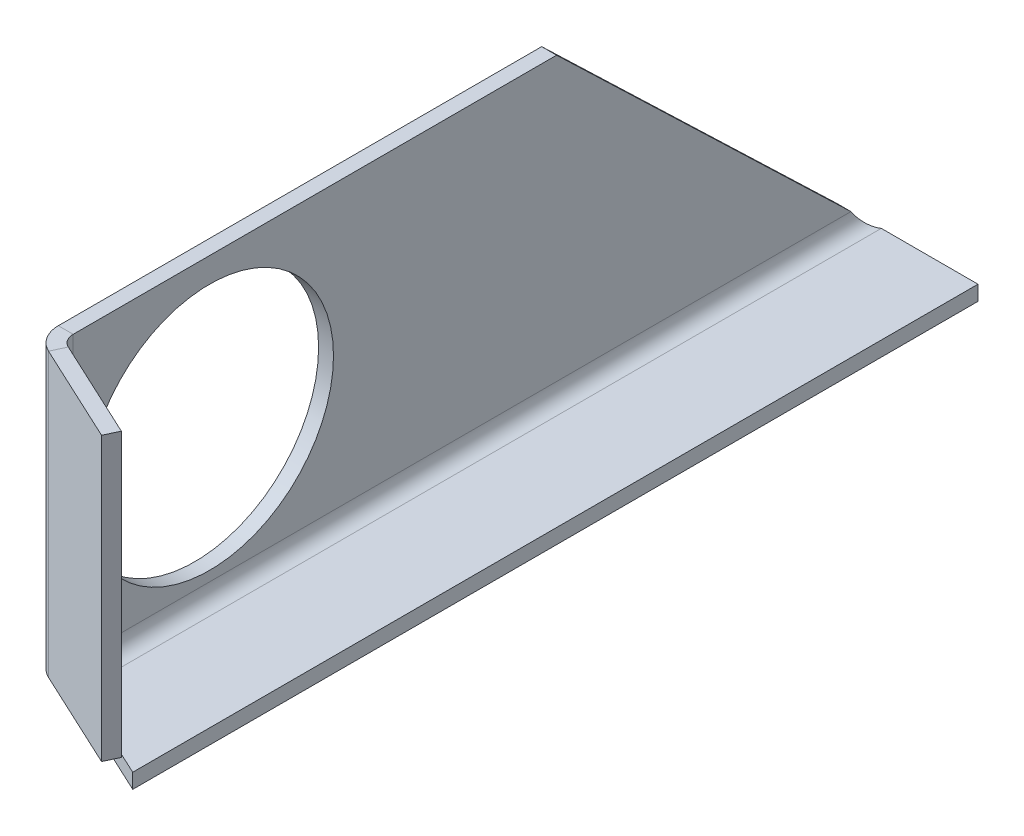
ISO-10303-21;
HEADER;
FILE_DESCRIPTION(('STEP AP214'),'2;1');
FILE_NAME('part.step','',(''),(''),'','','');
FILE_SCHEMA(('AUTOMOTIVE_DESIGN { 1 0 10303 214 1 1 1 1 }'));
ENDSEC;
DATA;
#1=APPLICATION_CONTEXT('core data for automotive mechanical design processes');
#2=APPLICATION_PROTOCOL_DEFINITION('international standard','automotive_design',2000,#1);
#3=PRODUCT_CONTEXT('',#1,'mechanical');
#4=PRODUCT('Part','Part','',(#3));
#5=PRODUCT_RELATED_PRODUCT_CATEGORY('part','',(#4));
#6=PRODUCT_DEFINITION_FORMATION('','',#4);
#7=PRODUCT_DEFINITION_CONTEXT('part definition',#1,'design');
#8=PRODUCT_DEFINITION('design','',#6,#7);
#9=PRODUCT_DEFINITION_SHAPE('','',#8);
#10=(LENGTH_UNIT() NAMED_UNIT(*) SI_UNIT(.MILLI.,.METRE.));
#11=(NAMED_UNIT(*) PLANE_ANGLE_UNIT() SI_UNIT($,.RADIAN.));
#12=(NAMED_UNIT(*) SI_UNIT($,.STERADIAN.) SOLID_ANGLE_UNIT());
#13=UNCERTAINTY_MEASURE_WITH_UNIT(LENGTH_MEASURE(1.E-05),#10,'distance_accuracy_value','');
#14=(GEOMETRIC_REPRESENTATION_CONTEXT(3) GLOBAL_UNCERTAINTY_ASSIGNED_CONTEXT((#13)) GLOBAL_UNIT_ASSIGNED_CONTEXT((#10,
#11,#12)) REPRESENTATION_CONTEXT('',''));
#15=CARTESIAN_POINT('',(0.,0.,0.));
#16=DIRECTION('',(0.,0.,1.));
#17=DIRECTION('',(1.,0.,0.));
#18=AXIS2_PLACEMENT_3D('',#15,#16,#17);
#19=CARTESIAN_POINT('',(-6.,0.,0.));
#20=DIRECTION('',(-1.,0.,0.));
#21=DIRECTION('',(0.,0.,1.));
#22=AXIS2_PLACEMENT_3D('',#19,#20,#21);
#23=PLANE('',#22);
#24=CARTESIAN_POINT('',(-6.,0.,0.));
#25=DIRECTION('',(1.,0.,0.));
#26=DIRECTION('',(0.,0.,-1.));
#27=AXIS2_PLACEMENT_3D('',#24,#25,#26);
#28=CIRCLE('',#27,50.);
#29=CARTESIAN_POINT('',(-6.,0.,-50.));
#30=VERTEX_POINT('',#29);
#31=EDGE_CURVE('E289',#30,#30,#28,.T.);
#32=ORIENTED_EDGE('',*,*,#31,.T.);
#33=EDGE_LOOP('',(#32));
#34=FACE_BOUND('',#33,.T.);
#35=DIRECTION('',(0.,0.692531828189713,0.721387321030952));
#36=VECTOR('',#35,1.);
#37=CARTESIAN_POINT('',(-6.,101.165695253955,-97.1190674437966));
#38=LINE('',#37,#36);
#39=CARTESIAN_POINT('',(-6.,60.,-140.));
#40=VERTEX_POINT('',#39);
#41=CARTESIAN_POINT('',(-5.99999999999999,-54.,-258.75));
#42=VERTEX_POINT('',#41);
#43=EDGE_CURVE('E13',#40,#42,#38,.F.);
#44=ORIENTED_EDGE('',*,*,#43,.T.);
#45=DIRECTION('',(0.,0.,-1.));
#46=VECTOR('',#45,1.);
#47=CARTESIAN_POINT('',(-5.99999999999999,-54.,-265.));
#48=LINE('',#47,#46);
#49=CARTESIAN_POINT('',(-6.00000000000005,-54.,55.));
#50=VERTEX_POINT('',#49);
#51=EDGE_CURVE('E234',#42,#50,#48,.F.);
#52=ORIENTED_EDGE('',*,*,#51,.T.);
#53=DIRECTION('',(0.,-1.,0.));
#54=VECTOR('',#53,1.);
#55=CARTESIAN_POINT('',(-6.,-60.,55.));
#56=LINE('',#55,#54);
#57=CARTESIAN_POINT('',(-6.,60.,55.));
#58=VERTEX_POINT('',#57);
#59=EDGE_CURVE('E325',#58,#50,#56,.T.);
#60=ORIENTED_EDGE('',*,*,#59,.F.);
#61=DIRECTION('',(0.,0.,1.));
#62=VECTOR('',#61,1.);
#63=CARTESIAN_POINT('',(-6.,60.,55.));
#64=LINE('',#63,#62);
#65=EDGE_CURVE('E331',#40,#58,#64,.T.);
#66=ORIENTED_EDGE('',*,*,#65,.F.);
#67=EDGE_LOOP('',(#44,#52,#60,#66));
#68=FACE_BOUND('',#67,.T.);
#69=ADVANCED_FACE('F58',(#34,#68),#23,.T.);
#70=CARTESIAN_POINT('',(0.,0.,0.));
#71=DIRECTION('',(-1.,0.,0.));
#72=DIRECTION('',(0.,0.,1.));
#73=AXIS2_PLACEMENT_3D('',#70,#71,#72);
#74=PLANE('',#73);
#75=CARTESIAN_POINT('',(0.,0.,0.));
#76=DIRECTION('',(1.,0.,0.));
#77=DIRECTION('',(0.,0.,-1.));
#78=AXIS2_PLACEMENT_3D('',#75,#76,#77);
#79=CIRCLE('',#78,50.);
#80=CARTESIAN_POINT('',(0.,0.,-50.));
#81=VERTEX_POINT('',#80);
#82=EDGE_CURVE('E241',#81,#81,#79,.T.);
#83=ORIENTED_EDGE('',*,*,#82,.F.);
#84=EDGE_LOOP('',(#83));
#85=FACE_BOUND('',#84,.T.);
#86=DIRECTION('',(0.,0.,-1.));
#87=VECTOR('',#86,1.);
#88=CARTESIAN_POINT('',(0.,-54.,-265.));
#89=LINE('',#88,#87);
#90=CARTESIAN_POINT('',(0.,-54.,-258.75));
#91=VERTEX_POINT('',#90);
#92=CARTESIAN_POINT('',(0.,-54.,55.));
#93=VERTEX_POINT('',#92);
#94=EDGE_CURVE('E231',#91,#93,#89,.F.);
#95=ORIENTED_EDGE('',*,*,#94,.F.);
#96=DIRECTION('',(0.,-0.692531828189713,-0.721387321030952));
#97=VECTOR('',#96,1.);
#98=CARTESIAN_POINT('',(0.,-60.0000000000004,-265.));
#99=LINE('',#98,#97);
#100=CARTESIAN_POINT('',(0.,60.,-140.));
#101=VERTEX_POINT('',#100);
#102=EDGE_CURVE('E80',#91,#101,#99,.F.);
#103=ORIENTED_EDGE('',*,*,#102,.T.);
#104=DIRECTION('',(0.,0.,1.));
#105=VECTOR('',#104,1.);
#106=CARTESIAN_POINT('',(0.,60.,55.));
#107=LINE('',#106,#105);
#108=CARTESIAN_POINT('',(0.,60.,55.));
#109=VERTEX_POINT('',#108);
#110=EDGE_CURVE('E320',#101,#109,#107,.T.);
#111=ORIENTED_EDGE('',*,*,#110,.T.);
#112=DIRECTION('',(0.,-1.,0.));
#113=VECTOR('',#112,1.);
#114=CARTESIAN_POINT('',(0.,-60.,55.));
#115=LINE('',#114,#113);
#116=EDGE_CURVE('E326',#109,#93,#115,.T.);
#117=ORIENTED_EDGE('',*,*,#116,.T.);
#118=EDGE_LOOP('',(#95,#103,#111,#117));
#119=FACE_BOUND('',#118,.T.);
#120=ADVANCED_FACE('F310',(#85,#119),#74,.F.);
#121=CARTESIAN_POINT('',(-6.,-60.0000000000004,-265.));
#122=DIRECTION('',(0.,-0.721387321030952,0.692531828189713));
#123=DIRECTION('',(1.,0.,0.));
#124=AXIS2_PLACEMENT_3D('',#121,#122,#123);
#125=PLANE('',#124);
#126=ORIENTED_EDGE('',*,*,#102,.F.);
#127=DIRECTION('',(-1.,0.,0.));
#128=VECTOR('',#127,1.);
#129=CARTESIAN_POINT('',(0.,-54.,-258.75));
#130=LINE('',#129,#128);
#131=EDGE_CURVE('E242',#91,#42,#130,.T.);
#132=ORIENTED_EDGE('',*,*,#131,.T.);
#133=ORIENTED_EDGE('',*,*,#43,.F.);
#134=DIRECTION('',(-1.,0.,0.));
#135=VECTOR('',#134,1.);
#136=CARTESIAN_POINT('',(-6.,60.,-140.));
#137=LINE('',#136,#135);
#138=EDGE_CURVE('E66',#101,#40,#137,.T.);
#139=ORIENTED_EDGE('',*,*,#138,.F.);
#140=EDGE_LOOP('',(#126,#132,#133,#139));
#141=FACE_BOUND('',#140,.T.);
#142=ADVANCED_FACE('F60',(#141),#125,.F.);
#143=CARTESIAN_POINT('',(-6.,60.,55.));
#144=DIRECTION('',(0.,1.,0.));
#145=DIRECTION('',(0.,0.,1.));
#146=AXIS2_PLACEMENT_3D('',#143,#144,#145);
#147=PLANE('',#146);
#148=ORIENTED_EDGE('',*,*,#110,.F.);
#149=ORIENTED_EDGE('',*,*,#138,.T.);
#150=ORIENTED_EDGE('',*,*,#65,.T.);
#151=DIRECTION('',(1.,0.,0.));
#152=VECTOR('',#151,1.);
#153=CARTESIAN_POINT('',(-6.,60.,55.));
#154=LINE('',#153,#152);
#155=EDGE_CURVE('E322',#58,#109,#154,.T.);
#156=ORIENTED_EDGE('',*,*,#155,.T.);
#157=EDGE_LOOP('',(#148,#149,#150,#156));
#158=FACE_BOUND('',#157,.T.);
#159=ADVANCED_FACE('F306',(#158),#147,.T.);
#160=CARTESIAN_POINT('',(-6.,0.,0.));
#161=DIRECTION('',(1.,0.,0.));
#162=DIRECTION('',(0.,0.,-1.));
#163=AXIS2_PLACEMENT_3D('',#160,#161,#162);
#164=CYLINDRICAL_SURFACE('',#163,50.);
#165=ORIENTED_EDGE('',*,*,#31,.F.);
#166=EDGE_LOOP('',(#165));
#167=FACE_BOUND('',#166,.T.);
#168=ORIENTED_EDGE('',*,*,#82,.T.);
#169=EDGE_LOOP('',(#168));
#170=FACE_BOUND('',#169,.T.);
#171=ADVANCED_FACE('F297',(#167,#170),#164,.F.);
#172=CARTESIAN_POINT('',(-6.06000000000001,-54.,55.));
#173=CARTESIAN_POINT('',(-6.06000000000001,-55.5789288833528,55.2331949848852));
#174=CARTESIAN_POINT('',(-5.74611048061989,-57.156679485373,55.466307658155));
#175=CARTESIAN_POINT('',(-4.53786384355235,-60.0736449032731,55.93261531631));
#176=CARTESIAN_POINT('',(-3.64398211932206,-61.4114334428975,56.1657691453875));
#177=CARTESIAN_POINT('',(-1.41143344289749,-63.6439821193221,56.6320768035425));
#178=CARTESIAN_POINT('',(-0.0736449032730689,-64.5378638435524,56.86523063262));
#179=CARTESIAN_POINT('',(2.84332051462705,-65.7461104806199,57.331538290775));
#180=CARTESIAN_POINT('',(4.42107111664722,-66.06,57.5646509640448));
#181=CARTESIAN_POINT('',(5.99999999999995,-66.06,57.79784594893));
#182=CARTESIAN_POINT('',(-6.00000000000002,-54.,55.));
#183=CARTESIAN_POINT('',(-6.00000000000001,-55.5710734320333,55.2331949599016));
#184=CARTESIAN_POINT('',(-5.68767212001979,-57.1409746123114,55.466307658155));
#185=CARTESIAN_POINT('',(-4.4854366602511,-60.0434277644508,55.93261531631));
#186=CARTESIAN_POINT('',(-3.59600210877817,-61.374560639699,56.1657691453875));
#187=CARTESIAN_POINT('',(-1.374560639699,-63.5960021087782,56.6320768035425));
#188=CARTESIAN_POINT('',(-0.0434277644508149,-64.4854366602511,56.86523063262));
#189=CARTESIAN_POINT('',(2.8590253876886,-65.6876721200198,57.331538290775));
#190=CARTESIAN_POINT('',(4.42892656796667,-66.,57.5646509890284));
#191=CARTESIAN_POINT('',(5.99999999999995,-66.,57.79784594893));
#192=CARTESIAN_POINT('',(0.,-54.,55.));
#193=CARTESIAN_POINT('',(0.,-54.7855283000878,55.2331924615433));
#194=CARTESIAN_POINT('',(0.156163939990096,-55.5704873061557,55.466307658155));
#195=CARTESIAN_POINT('',(0.757281669874444,-57.0217138822254,55.93261531631));
#196=CARTESIAN_POINT('',(1.20199894561091,-57.6872803198495,56.1657691453875));
#197=CARTESIAN_POINT('',(2.3127196801505,-58.7980010543891,56.6320768035425));
#198=CARTESIAN_POINT('',(2.97828611777459,-59.2427183301256,56.86523063262));
#199=CARTESIAN_POINT('',(4.4295126938443,-59.8438360600099,57.331538290775));
#200=CARTESIAN_POINT('',(5.21447169991215,-60.,57.5646534873867));
#201=CARTESIAN_POINT('',(5.99999999999998,-60.,57.79784594893));
#202=CARTESIAN_POINT('',(0.0605999999999852,-54.,55.));
#203=CARTESIAN_POINT('',(0.0605999999999879,-54.7775942942552,55.2331924363098));
#204=CARTESIAN_POINT('',(0.215186684196196,-55.5546253843635,55.466307658155));
#205=CARTESIAN_POINT('',(0.810233125008712,-56.9911945720149,55.93261531631));
#206=CARTESIAN_POINT('',(1.25045875626024,-57.650038788619,56.1657691453875));
#207=CARTESIAN_POINT('',(2.34996121138098,-58.7495412437398,56.6320768035425));
#208=CARTESIAN_POINT('',(3.00880542798507,-59.1897668749913,56.86523063262));
#209=CARTESIAN_POINT('',(4.44537461563647,-59.7848133158038,57.331538290775));
#210=CARTESIAN_POINT('',(5.2224057057448,-59.9394,57.5646535126201));
#211=CARTESIAN_POINT('',(5.99999999999998,-59.9394,57.79784594893));
#212=B_SPLINE_SURFACE_WITH_KNOTS('',1,3,((#172,#173,#174,#175,#176,#177,#178,#179,#180,#181),
(#182,#183,#184,#185,#186,#187,#188,#189,#190,#191),(#192,#193,#194,#195,#196,#197,#198,#199,
#200,#201),(#202,#203,#204,#205,#206,#207,#208,#209,#210,#211)),.UNSPECIFIED.,.F.,.F.,.F.,(2,1,
1,2),(4,2,2,2,4),(-0.01,0.,1.,1.0101),(0.,0.25,0.5,0.75,1.),.UNSPECIFIED.);
#213=DIRECTION('',(0.,-1.,0.));
#214=VECTOR('',#213,1.);
#215=CARTESIAN_POINT('',(5.99999999999998,-60.,57.79784594893));
#216=LINE('',#215,#214);
#217=CARTESIAN_POINT('',(5.99999999999998,-60.,57.79784594893));
#218=VERTEX_POINT('',#217);
#219=CARTESIAN_POINT('',(5.99999999999995,-66.,57.79784594893));
#220=VERTEX_POINT('',#219);
#221=EDGE_CURVE('E191',#218,#220,#216,.T.);
#222=CARTESIAN_POINT('',(0.,-54.,55.));
#223=CARTESIAN_POINT('',(-2.15144091810674E-05,-54.1761389818001,55.0522909540916));
#224=CARTESIAN_POINT('',(0.00775532794336327,-54.3522750721139,55.1045808272868));
#225=CARTESIAN_POINT('',(0.0387504266305628,-54.7031752260657,55.2091555829115));
#226=CARTESIAN_POINT('',(0.061967874513847,-54.8779393610529,55.261440465459));
#227=CARTESIAN_POINT('',(0.123664678233625,-55.2246119033116,55.3659668246328));
#228=CARTESIAN_POINT('',(0.162132033652604,-55.3965224455654,55.4182083030997));
#229=CARTESIAN_POINT('',(0.2540232561137,-55.7362944544979,55.5226953450264));
#230=CARTESIAN_POINT('',(0.307446924654901,-55.9041559748834,55.574940908423));
#231=CARTESIAN_POINT('',(0.428860956902002,-56.2345926120071,55.6794498079185));
#232=CARTESIAN_POINT('',(0.496856412286408,-56.3971658579858,55.731713143838));
#233=CARTESIAN_POINT('',(0.646903552073337,-56.7157640547587,55.8362594245457));
#234=CARTESIAN_POINT('',(0.728960405714377,-56.8717865710244,55.8885423694646));
#235=CARTESIAN_POINT('',(0.90643985867804,-57.175946254322,55.9930809266557));
#236=CARTESIAN_POINT('',(1.00185668225554,-57.3240867908791,56.0453365409964));
#237=CARTESIAN_POINT('',(1.20534506930976,-57.6114090432682,56.1498516532057));
#238=CARTESIAN_POINT('',(1.31341689819113,-57.7505905711143,56.2021111511326));
#239=CARTESIAN_POINT('',(1.54133605697818,-58.0188660696668,56.3066136286119));
#240=CARTESIAN_POINT('',(1.66117916789539,-58.1479636250395,56.3588566073983));
#241=CARTESIAN_POINT('',(1.91174618743968,-58.395127907494,56.4633430464923));
#242=CARTESIAN_POINT('',(2.04247009481799,-58.5131946358418,56.5155865067997));
#243=CARTESIAN_POINT('',(2.31383696774827,-58.7374247100262,56.6200885789936));
#244=CARTESIAN_POINT('',(2.45448347226505,-58.8435837735903,56.672347189598));
#245=CARTESIAN_POINT('',(2.74456152074831,-59.0431250313135,56.77686189978));
#246=CARTESIAN_POINT('',(2.893992880223,-59.1365074936586,56.8291179993873));
#247=CARTESIAN_POINT('',(3.20057273254504,-59.3098241451779,56.933665089021));
#248=CARTESIAN_POINT('',(3.35772560749733,-59.3897505812141,56.9859560818517));
#249=CARTESIAN_POINT('',(3.67839342032031,-59.5354444146836,57.0905179454703));
#250=CARTESIAN_POINT('',(3.84190598521864,-59.6012170345669,57.142788816552));
#251=CARTESIAN_POINT('',(4.17395816042236,-59.7180877811297,57.2472918348596));
#252=CARTESIAN_POINT('',(4.34249399861424,-59.7691966273119,57.2995239823897));
#253=CARTESIAN_POINT('',(4.68334415798512,-59.8563941676811,57.4039650852479));
#254=CARTESIAN_POINT('',(4.85565702051379,-59.8924885563557,57.4561740418532));
#255=CARTESIAN_POINT('',(5.18973203393827,-59.9472611123116,57.5566682799792));
#256=CARTESIAN_POINT('',(5.35131404284448,-59.9670441766197,57.6049536032594));
#257=CARTESIAN_POINT('',(5.67526293107495,-59.9934093068567,57.7014406118656));
#258=CARTESIAN_POINT('',(5.83762791760069,-60.0000146509969,57.7496422941275));
#259=CARTESIAN_POINT('',(5.99999999999998,-60.,57.79784594893));
#260=B_SPLINE_CURVE_WITH_KNOTS('',3,(#222,#223,#224,#225,#226,#227,#228,#229,#230,#231,#232,
#233,#234,#235,#236,#237,#238,#239,#240,#241,#242,#243,#244,#245,#246,#247,#248,#249,#250,#251,
#252,#253,#254,#255,#256,#257,#258,#259),.UNSPECIFIED.,.F.,.F.,(4,2,2,2,2,2,2,2,2,2,2,2,2,2,2,2,
2,2,4),(0.,0.551042157186006,1.10205546474453,1.65263602830496,2.20320928487972,
2.75397523753178,3.30494409833757,3.85567549706838,4.40641844797609,4.95696472041301,
5.50751092966526,6.05825449759598,6.60898650342437,7.16003475382676,7.71087932946694,
8.26132019505213,8.81155210584425,9.32043813279999,9.8284244227305),.UNSPECIFIED.);
#261=EDGE_CURVE('E233',#93,#218,#260,.T.);
#262=DIRECTION('',(-1.,0.,0.));
#263=VECTOR('',#262,1.);
#264=CARTESIAN_POINT('',(0.,-54.,55.));
#265=LINE('',#264,#263);
#266=EDGE_CURVE('E238',#93,#50,#265,.T.);
#267=CARTESIAN_POINT('',(-6.00000000000002,-54.,55.));
#268=CARTESIAN_POINT('',(-6.00003790028094,-54.3412243018984,55.0506500390791));
#269=CARTESIAN_POINT('',(-5.9854473388713,-54.6824432268159,55.1012992586472));
#270=CARTESIAN_POINT('',(-5.92728301260224,-55.3623861455304,55.2025930218229));
#271=CARTESIAN_POINT('',(-5.88371067037933,-55.7011102609657,55.2532375655381));
#272=CARTESIAN_POINT('',(-5.76790066788971,-56.3733567070297,55.3544852568405));
#273=CARTESIAN_POINT('',(-5.69568491300865,-56.7068828107922,55.4050884065188));
#274=CARTESIAN_POINT('',(-5.52312530445689,-57.3665718968484,55.5062986606794));
#275=CARTESIAN_POINT('',(-5.42278180045249,-57.6927349706201,55.5569057651047));
#276=CARTESIAN_POINT('',(-5.19463077476035,-58.3355057108797,55.6581467515921));
#277=CARTESIAN_POINT('',(-5.06680866365409,-58.6521081990592,55.7087806335699));
#278=CARTESIAN_POINT('',(-4.78466194654772,-59.2732750263628,55.8100494231126));
#279=CARTESIAN_POINT('',(-4.63033733450176,-59.5778393627405,55.8606843306778));
#280=CARTESIAN_POINT('',(-4.29633801176093,-60.1726610077219,55.9619397800222));
#281=CARTESIAN_POINT('',(-4.11666806522916,-60.4629209913108,56.012560322714));
#282=CARTESIAN_POINT('',(-3.73326311803992,-61.0270839019236,56.1138019068838));
#283=CARTESIAN_POINT('',(-3.52952825276438,-61.3009869209539,56.1644229483575));
#284=CARTESIAN_POINT('',(-3.09947784129804,-61.8304416945944,56.2656682644982));
#285=CARTESIAN_POINT('',(-2.87316277043491,-62.0859938353076,56.3162925390747));
#286=CARTESIAN_POINT('',(-2.39959076338149,-62.5768986314894,56.4175403728616));
#287=CARTESIAN_POINT('',(-2.15233370337324,-62.8122511675128,56.468163932066));
#288=CARTESIAN_POINT('',(-1.63861391694684,-63.2610986398374,56.5694222705046));
#289=CARTESIAN_POINT('',(-1.37214662928893,-63.4745883557532,56.6200570495389));
#290=CARTESIAN_POINT('',(-0.822000073682004,-63.8780910291423,56.7213216950589));
#291=CARTESIAN_POINT('',(-0.538321107945511,-64.0681043986491,56.7719515616153));
#292=CARTESIAN_POINT('',(0.0442631570452352,-64.4233210257973,56.8732277690684));
#293=CARTESIAN_POINT('',(0.343172204444952,-64.5885181362405,56.9238741109427));
#294=CARTESIAN_POINT('',(0.953976235883364,-64.8928451466537,57.0251676388086));
#295=CARTESIAN_POINT('',(1.26587125699582,-65.0319749721977,57.0758148248022));
#296=CARTESIAN_POINT('',(1.90020765317877,-65.2830835811781,57.1770822646163));
#297=CARTESIAN_POINT('',(2.22264284891777,-65.3950779603068,57.2277025171428));
#298=CARTESIAN_POINT('',(2.8757526201895,-65.591175646526,57.328919513622));
#299=CARTESIAN_POINT('',(3.20642489458648,-65.6752866513035,57.3795162602057));
#300=CARTESIAN_POINT('',(3.94458881859024,-65.8298723442943,57.4914540977997));
#301=CARTESIAN_POINT('',(4.35350906596996,-65.893679446444,57.5527997510355));
#302=CARTESIAN_POINT('',(4.96968420380285,-65.9574701090814,57.6447482366965));
#303=CARTESIAN_POINT('',(5.17541392856748,-65.97341365079,57.6753671977784));
#304=CARTESIAN_POINT('',(5.58741525512764,-65.9946778120893,57.7366042687587));
#305=CARTESIAN_POINT('',(5.79368683984943,-65.9999987624655,57.7672223786539));
#306=CARTESIAN_POINT('',(5.99999999999995,-66.,57.79784594893));
#307=B_SPLINE_CURVE_WITH_KNOTS('',3,(#267,#268,#269,#270,#271,#272,#273,#274,#275,#276,#277,
#278,#279,#280,#281,#282,#283,#284,#285,#286,#287,#288,#289,#290,#291,#292,#293,#294,#295,#296,
#297,#298,#299,#300,#301,#302,#303,#304,#305,#306),.UNSPECIFIED.,.F.,.F.,(4,2,2,2,2,2,2,2,2,2,2,
2,2,2,2,2,2,2,2,4),(0.,1.03457281982163,2.06909485903493,3.10282725614606,4.13654680312292,
5.17081655191661,6.20508653665216,7.23916236804853,8.27323238232517,9.30728063336194,
10.3413349985592,11.3756357014667,12.4099182487813,13.4444565756934,14.4789978563196,
15.5129431318547,16.5466027307849,17.799322715089,18.4249112842112,19.050480372311),.UNSPECIFIED.);
#308=EDGE_CURVE('E236',#50,#220,#307,.T.);
#309=ORIENTED_EDGE('',*,*,#221,.F.);
#310=ORIENTED_EDGE('',*,*,#261,.F.);
#311=ORIENTED_EDGE('',*,*,#266,.T.);
#312=ORIENTED_EDGE('',*,*,#308,.T.);
#313=EDGE_LOOP('',(#309,#310,#311,#312));
#314=FACE_BOUND('',#313,.T.);
#315=ADVANCED_FACE('F259',(#314),#212,.F.);
#316=CARTESIAN_POINT('',(5.99999999999998,-66.06,-265.));
#317=CARTESIAN_POINT('',(4.42109296543425,-66.06,-264.479081869375));
#318=CARTESIAN_POINT('',(2.84332051462706,-65.7461104806199,-263.958333333333));
#319=CARTESIAN_POINT('',(-0.0736449032730697,-64.5378638435524,-262.916666666667));
#320=CARTESIAN_POINT('',(-1.41143344289749,-63.643982119322,-262.395833333333));
#321=CARTESIAN_POINT('',(-3.64398211932207,-61.4114334428974,-261.354166666666));
#322=CARTESIAN_POINT('',(-4.53786384355236,-60.073644903273,-260.833333333333));
#323=CARTESIAN_POINT('',(-5.74611048061989,-57.1566794853729,-259.791666666666));
#324=CARTESIAN_POINT('',(-6.06,-55.5789070345656,-259.270918130624));
#325=CARTESIAN_POINT('',(-6.05999999999999,-54.,-258.75));
#326=CARTESIAN_POINT('',(5.99999999999998,-66.,-265.));
#327=CARTESIAN_POINT('',(4.4289485151175,-66.,-264.479082063186));
#328=CARTESIAN_POINT('',(2.85902538768861,-65.6876721200198,-263.958333333333));
#329=CARTESIAN_POINT('',(-0.0434277644508155,-64.4854366602511,-262.916666666667));
#330=CARTESIAN_POINT('',(-1.374560639699,-63.5960021087782,-262.395833333333));
#331=CARTESIAN_POINT('',(-3.59600210877818,-61.374560639699,-261.354166666666));
#332=CARTESIAN_POINT('',(-4.4854366602511,-60.0434277644508,-260.833333333333));
#333=CARTESIAN_POINT('',(-5.68767212001979,-57.1409746123113,-259.791666666666));
#334=CARTESIAN_POINT('',(-6.,-55.5710514848824,-259.270917936814));
#335=CARTESIAN_POINT('',(-5.99999999999999,-54.,-258.75));
#336=CARTESIAN_POINT('',(6.,-60.,-265.));
#337=CARTESIAN_POINT('',(5.21450348344267,-60.,-264.479101444202));
#338=CARTESIAN_POINT('',(4.42951269384432,-59.8438360600099,-263.958333333333));
#339=CARTESIAN_POINT('',(2.9782861177746,-59.2427183301255,-262.916666666667));
#340=CARTESIAN_POINT('',(2.31271968015051,-58.7980010543891,-262.395833333333));
#341=CARTESIAN_POINT('',(1.20199894561092,-57.6872803198495,-261.354166666666));
#342=CARTESIAN_POINT('',(0.757281669874452,-57.0217138822254,-260.833333333333));
#343=CARTESIAN_POINT('',(0.15616393999011,-55.5704873061557,-259.791666666666));
#344=CARTESIAN_POINT('',(0.,-54.7854965165573,-259.270898555798));
#345=CARTESIAN_POINT('',(0.,-54.,-258.75));
#346=CARTESIAN_POINT('',(6.,-59.9394,-265.));
#347=CARTESIAN_POINT('',(5.22243758862276,-59.9394,-264.47910163995));
#348=CARTESIAN_POINT('',(4.44537461563649,-59.7848133158038,-263.958333333333));
#349=CARTESIAN_POINT('',(3.00880542798508,-59.1897668749913,-262.916666666667));
#350=CARTESIAN_POINT('',(2.34996121138099,-58.7495412437397,-262.395833333333));
#351=CARTESIAN_POINT('',(1.25045875626025,-57.650038788619,-261.354166666666));
#352=CARTESIAN_POINT('',(0.810233125008721,-56.9911945720149,-260.833333333333));
#353=CARTESIAN_POINT('',(0.21518668419621,-55.5546253843635,-259.791666666666));
#354=CARTESIAN_POINT('',(0.0606000000000051,-54.7775624113772,-259.27089836005));
#355=CARTESIAN_POINT('',(0.0606000000000078,-54.,-258.75));
#356=B_SPLINE_SURFACE_WITH_KNOTS('',1,3,((#316,#317,#318,#319,#320,#321,#322,#323,#324,#325),
(#326,#327,#328,#329,#330,#331,#332,#333,#334,#335),(#336,#337,#338,#339,#340,#341,#342,#343,
#344,#345),(#346,#347,#348,#349,#350,#351,#352,#353,#354,#355)),.UNSPECIFIED.,.F.,.F.,.F.,(2,1,
1,2),(4,2,2,2,4),(-0.01,0.,1.,1.0101),(0.,0.25,0.5,0.75,1.),.UNSPECIFIED.);
#357=CARTESIAN_POINT('',(6.,-60.,-265.));
#358=CARTESIAN_POINT('',(5.8935345518422,-60.000000386075,-264.929396938866));
#359=CARTESIAN_POINT('',(5.78708428080582,-59.9971656735165,-264.858802170085));
#360=CARTESIAN_POINT('',(5.57448536957958,-59.9858392371346,-264.717613188104));
#361=CARTESIAN_POINT('',(5.46833672820195,-59.9773475356186,-264.647018974901));
#362=CARTESIAN_POINT('',(5.15080885084926,-59.9434130999289,-264.435252273164));
#363=CARTESIAN_POINT('',(4.94028706231894,-59.9095110190051,-264.294055757613));
#364=CARTESIAN_POINT('',(4.52432942960692,-59.8195908428267,-264.011853971424));
#365=CARTESIAN_POINT('',(4.3188876153212,-59.763600161455,-263.870848680302));
#366=CARTESIAN_POINT('',(3.9151121176871,-59.6301368019278,-263.588835426365));
#367=CARTESIAN_POINT('',(3.71677794098166,-59.5526656180562,-263.447827464419));
#368=CARTESIAN_POINT('',(3.33842766128901,-59.3811856906141,-263.172348996665));
#369=CARTESIAN_POINT('',(3.15798859847762,-59.2881087091216,-263.037878083684));
#370=CARTESIAN_POINT('',(2.80745236094588,-59.0841667011273,-262.768946924298));
#371=CARTESIAN_POINT('',(2.63735499055172,-58.973302011329,-262.63448667774));
#372=CARTESIAN_POINT('',(2.30934398931972,-58.7349905639689,-262.365627554593));
#373=CARTESIAN_POINT('',(2.1514241611153,-58.6075523308851,-262.231228681854));
#374=CARTESIAN_POINT('',(1.84928799764518,-58.3373565022463,-261.96242981964));
#375=CARTESIAN_POINT('',(1.70507155266737,-58.1945990293597,-261.828029830181));
#376=CARTESIAN_POINT('',(1.4318201812957,-57.8952286489344,-261.559231946487));
#377=CARTESIAN_POINT('',(1.30278513909002,-57.7386158471074,-261.424834052244));
#378=CARTESIAN_POINT('',(1.06121223120496,-57.4131289274409,-261.156042667955));
#379=CARTESIAN_POINT('',(0.948674929626373,-57.2442543906357,-261.021649178216));
#380=CARTESIAN_POINT('',(0.741236810124621,-56.8959475662468,-260.752817331753));
#381=CARTESIAN_POINT('',(0.646340828733247,-56.7165124010684,-260.618378972818));
#382=CARTESIAN_POINT('',(0.475201557451247,-56.348974737111,-260.349512527944));
#383=CARTESIAN_POINT('',(0.398955900902427,-56.1608733416486,-260.215084442867));
#384=CARTESIAN_POINT('',(0.27751041858595,-55.811384509655,-259.969722250479));
#385=CARTESIAN_POINT('',(0.229214366498759,-55.6510669874942,-259.85878407839));
#386=CARTESIAN_POINT('',(0.14618626732186,-55.3269675282176,-259.636923924644));
#387=CARTESIAN_POINT('',(0.111452505355552,-55.1631860318645,-259.526001942713));
#388=CARTESIAN_POINT('',(0.0558165644805001,-54.8334307997657,-259.304243968001));
#389=CARTESIAN_POINT('',(0.0349032811273477,-54.6674589335751,-259.19340797783));
#390=CARTESIAN_POINT('',(0.00698534629313814,-54.3343256834615,-258.971715215974));
#391=CARTESIAN_POINT('',(-1.71097828743996E-05,-54.1671641159569,-258.86085844377));
#392=CARTESIAN_POINT('',(0.,-54.,-258.75));
#393=B_SPLINE_CURVE_WITH_KNOTS('',3,(#357,#358,#359,#360,#361,#362,#363,#364,#365,#366,#367,
#368,#369,#370,#371,#372,#373,#374,#375,#376,#377,#378,#379,#380,#381,#382,#383,#384,#385,#386,
#387,#388,#389,#390,#391,#392),.UNSPECIFIED.,.F.,.F.,(4,2,2,2,2,2,2,2,2,2,2,2,2,2,2,2,2,4),(0.,
0.383179744038343,0.766357977080515,1.53249744391635,2.29768904102942,3.0628274211953,
3.7925399310859,4.52223862988216,5.25156348707753,5.98088250465529,6.71019595823878,
7.43953434313821,8.16907238899264,8.89851781104826,9.50060448707672,10.1026150079014,
10.7041412367733,11.3057623909009),.UNSPECIFIED.);
#394=CARTESIAN_POINT('',(6.,-60.,-265.));
#395=VERTEX_POINT('',#394);
#396=EDGE_CURVE('E230',#395,#91,#393,.T.);
#397=DIRECTION('',(0.,-1.,0.));
#398=VECTOR('',#397,1.);
#399=CARTESIAN_POINT('',(6.,-60.,-265.));
#400=LINE('',#399,#398);
#401=CARTESIAN_POINT('',(5.99999999999998,-66.,-265.));
#402=VERTEX_POINT('',#401);
#403=EDGE_CURVE('E203',#395,#402,#400,.T.);
#404=CARTESIAN_POINT('',(5.99999999999998,-66.,-265.));
#405=CARTESIAN_POINT('',(5.64435723174811,-66.0000446923797,-264.882073422832));
#406=CARTESIAN_POINT('',(5.28872034050823,-65.9841916646066,-264.764149444082));
#407=CARTESIAN_POINT('',(4.58026963949708,-65.9210127128078,-264.528312859313));
#408=CARTESIAN_POINT('',(4.22745567972943,-65.8736884723949,-264.410400253024));
#409=CARTESIAN_POINT('',(3.5277000070849,-65.7479392608087,-264.174673112024));
#410=CARTESIAN_POINT('',(3.18075387576065,-65.6695388861875,-264.056858573419));
#411=CARTESIAN_POINT('',(2.49519274739091,-65.4822720340691,-263.821220379173));
#412=CARTESIAN_POINT('',(2.15657763954352,-65.3734059620018,-263.703396723674));
#413=CARTESIAN_POINT('',(1.49009322674993,-65.1259694173238,-263.467663202218));
#414=CARTESIAN_POINT('',(1.16223208120878,-64.9873769650626,-263.34975333716));
#415=CARTESIAN_POINT('',(0.52010904582387,-64.6816312120802,-263.113933452563));
#416=CARTESIAN_POINT('',(0.205847159588999,-64.5144779037798,-262.996023433024));
#417=CARTESIAN_POINT('',(-0.406522360070101,-64.1529729468244,-262.760242851557));
#418=CARTESIAN_POINT('',(-0.704633963194065,-63.9586280242635,-262.642372287076));
#419=CARTESIAN_POINT('',(-1.28242631465999,-63.5442472710276,-262.406624558093));
#420=CARTESIAN_POINT('',(-1.56210718402188,-63.3242116090696,-262.28874739364));
#421=CARTESIAN_POINT('',(-2.10081526906865,-62.8602009530433,-262.052997752629));
#422=CARTESIAN_POINT('',(-2.35984390168575,-62.6162276038855,-261.935125276305));
#423=CARTESIAN_POINT('',(-2.8552269831548,-62.1062523087929,-261.699377639685));
#424=CARTESIAN_POINT('',(-3.09158124731205,-61.840250183455,-261.581502479375));
#425=CARTESIAN_POINT('',(-3.53983882934464,-61.2882059818815,-261.345714755559));
#426=CARTESIAN_POINT('',(-3.75173240945993,-61.0021559969546,-261.227802195768));
#427=CARTESIAN_POINT('',(-4.14927893236508,-60.4123789399208,-260.991981096283));
#428=CARTESIAN_POINT('',(-4.33493255473176,-60.1086523259005,-260.874072556565));
#429=CARTESIAN_POINT('',(-4.67861340580661,-59.4857810880324,-260.63819331123));
#430=CARTESIAN_POINT('',(-4.83662844373287,-59.1666297394837,-260.520222601087));
#431=CARTESIAN_POINT('',(-5.12368484806375,-58.5155518393837,-260.284283240491));
#432=CARTESIAN_POINT('',(-5.25272629404642,-58.1836253229233,-260.166314590033));
#433=CARTESIAN_POINT('',(-5.48069692542394,-57.5099738900071,-259.930502716959));
#434=CARTESIAN_POINT('',(-5.57965708889509,-57.1682594529396,-259.812659490697));
#435=CARTESIAN_POINT('',(-5.74683321138436,-56.4775221846024,-259.577024789144));
#436=CARTESIAN_POINT('',(-5.8150618121351,-56.1285024203947,-259.459233312523));
#437=CARTESIAN_POINT('',(-5.91174109557699,-55.4828897751743,-259.24278504839));
#438=CARTESIAN_POINT('',(-5.94485173612736,-55.1869858947214,-259.144126814945));
#439=CARTESIAN_POINT('',(-5.98897110585709,-54.5940598771389,-258.946981104398));
#440=CARTESIAN_POINT('',(-6.00001861077384,-54.297040622664,-258.848493632199));
#441=CARTESIAN_POINT('',(-5.99999999999999,-54.,-258.75));
#442=B_SPLINE_CURVE_WITH_KNOTS('',3,(#404,#405,#406,#407,#408,#409,#410,#411,#412,#413,#414,
#415,#416,#417,#418,#419,#420,#421,#422,#423,#424,#425,#426,#427,#428,#429,#430,#431,#432,#433,
#434,#435,#436,#437,#438,#439,#440,#441),.UNSPECIFIED.,.F.,.F.,(4,2,2,2,2,2,2,2,2,2,2,2,2,2,2,2,
2,2,4),(0.,1.12370920562944,2.2473583011127,3.37011980609002,4.49286637035284,5.61644597164143,
6.74002587109608,7.86332833254895,8.98662341743551,10.1098413675733,11.2330684661381,
12.3567411887547,13.4803848045447,14.6045227922369,15.7286576923658,16.851630991656,
17.9741419219276,18.9143909252648,19.8529859911619),.UNSPECIFIED.);
#443=EDGE_CURVE('E237',#402,#42,#442,.T.);
#444=ORIENTED_EDGE('',*,*,#396,.F.);
#445=ORIENTED_EDGE('',*,*,#403,.T.);
#446=ORIENTED_EDGE('',*,*,#443,.T.);
#447=ORIENTED_EDGE('',*,*,#131,.F.);
#448=EDGE_LOOP('',(#444,#445,#446,#447));
#449=FACE_BOUND('',#448,.T.);
#450=ADVANCED_FACE('F269',(#449),#356,.F.);
#451=CARTESIAN_POINT('',(6.00000000000002,-54.,-265.));
#452=DIRECTION('',(0.,0.,-1.));
#453=DIRECTION('',(0.,-1.,0.));
#454=AXIS2_PLACEMENT_3D('',#451,#452,#453);
#455=CYLINDRICAL_SURFACE('',#454,12.);
#456=ORIENTED_EDGE('',*,*,#51,.F.);
#457=ORIENTED_EDGE('',*,*,#443,.F.);
#458=DIRECTION('',(0.,0.,1.));
#459=VECTOR('',#458,1.);
#460=CARTESIAN_POINT('',(5.99999999999996,-66.,0.));
#461=LINE('',#460,#459);
#462=EDGE_CURVE('E206',#402,#220,#461,.T.);
#463=ORIENTED_EDGE('',*,*,#462,.T.);
#464=ORIENTED_EDGE('',*,*,#308,.F.);
#465=EDGE_LOOP('',(#456,#457,#463,#464));
#466=FACE_BOUND('',#465,.T.);
#467=ADVANCED_FACE('F264',(#466),#455,.T.);
#468=CARTESIAN_POINT('',(6.00000000000002,-54.,-265.));
#469=DIRECTION('',(0.,0.,-1.));
#470=DIRECTION('',(0.,-1.,0.));
#471=AXIS2_PLACEMENT_3D('',#468,#469,#470);
#472=CYLINDRICAL_SURFACE('',#471,6.00000000000001);
#473=ORIENTED_EDGE('',*,*,#94,.T.);
#474=ORIENTED_EDGE('',*,*,#261,.T.);
#475=DIRECTION('',(0.,0.,-1.));
#476=VECTOR('',#475,1.);
#477=CARTESIAN_POINT('',(5.99999999999998,-60.,57.79784594893));
#478=LINE('',#477,#476);
#479=EDGE_CURVE('E201',#218,#395,#478,.T.);
#480=ORIENTED_EDGE('',*,*,#479,.T.);
#481=ORIENTED_EDGE('',*,*,#396,.T.);
#482=EDGE_LOOP('',(#473,#474,#480,#481));
#483=FACE_BOUND('',#482,.T.);
#484=ADVANCED_FACE('F268',(#483),#472,.F.);
#485=CARTESIAN_POINT('',(45.,-66.0000000000001,-265.));
#486=DIRECTION('',(0.,0.,1.));
#487=DIRECTION('',(0.,-1.,0.));
#488=AXIS2_PLACEMENT_3D('',#485,#486,#487);
#489=PLANE('',#488);
#490=ORIENTED_EDGE('',*,*,#403,.F.);
#491=DIRECTION('',(1.,0.,0.));
#492=VECTOR('',#491,1.);
#493=CARTESIAN_POINT('',(45.,-60.0000000000001,-265.));
#494=LINE('',#493,#492);
#495=CARTESIAN_POINT('',(45.,-60.0000000000001,-265.));
#496=VERTEX_POINT('',#495);
#497=EDGE_CURVE('E210',#395,#496,#494,.T.);
#498=ORIENTED_EDGE('',*,*,#497,.T.);
#499=DIRECTION('',(0.,1.,0.));
#500=VECTOR('',#499,1.);
#501=CARTESIAN_POINT('',(45.,-66.0000000000001,-265.));
#502=LINE('',#501,#500);
#503=CARTESIAN_POINT('',(45.,-66.0000000000001,-265.));
#504=VERTEX_POINT('',#503);
#505=EDGE_CURVE('E227',#504,#496,#502,.T.);
#506=ORIENTED_EDGE('',*,*,#505,.F.);
#507=DIRECTION('',(1.,0.,0.));
#508=VECTOR('',#507,1.);
#509=CARTESIAN_POINT('',(45.,-66.0000000000001,-265.));
#510=LINE('',#509,#508);
#511=EDGE_CURVE('E211',#402,#504,#510,.T.);
#512=ORIENTED_EDGE('',*,*,#511,.F.);
#513=EDGE_LOOP('',(#490,#498,#506,#512));
#514=FACE_BOUND('',#513,.T.);
#515=ADVANCED_FACE('F271',(#514),#489,.F.);
#516=CARTESIAN_POINT('',(0.,-66.,55.));
#517=DIRECTION('',(0.422618261740704,0.,-0.906307787036648));
#518=DIRECTION('',(-0.906307787036648,0.,-0.422618261740704));
#519=AXIS2_PLACEMENT_3D('',#516,#517,#518);
#520=PLANE('',#519);
#521=ORIENTED_EDGE('',*,*,#221,.T.);
#522=DIRECTION('',(-0.906307787036648,0.,-0.422618261740704));
#523=VECTOR('',#522,1.);
#524=CARTESIAN_POINT('',(0.,-66.,55.));
#525=LINE('',#524,#523);
#526=CARTESIAN_POINT('',(45.,-66.0000000000002,75.9838446169752));
#527=VERTEX_POINT('',#526);
#528=EDGE_CURVE('E216',#527,#220,#525,.T.);
#529=ORIENTED_EDGE('',*,*,#528,.F.);
#530=DIRECTION('',(0.,1.,0.));
#531=VECTOR('',#530,1.);
#532=CARTESIAN_POINT('',(45.,-66.0000000000002,75.9838446169752));
#533=LINE('',#532,#531);
#534=CARTESIAN_POINT('',(45.,-60.0000000000002,75.9838446169752));
#535=VERTEX_POINT('',#534);
#536=EDGE_CURVE('E219',#527,#535,#533,.T.);
#537=ORIENTED_EDGE('',*,*,#536,.T.);
#538=DIRECTION('',(-0.906307787036648,0.,-0.422618261740704));
#539=VECTOR('',#538,1.);
#540=CARTESIAN_POINT('',(0.,-60.,55.));
#541=LINE('',#540,#539);
#542=EDGE_CURVE('E214',#535,#218,#541,.T.);
#543=ORIENTED_EDGE('',*,*,#542,.T.);
#544=EDGE_LOOP('',(#521,#529,#537,#543));
#545=FACE_BOUND('',#544,.T.);
#546=ADVANCED_FACE('F384',(#545),#520,.F.);
#547=CARTESIAN_POINT('',(-2.33741634419547E-13,-66.,0.));
#548=DIRECTION('',(0.,1.,0.));
#549=DIRECTION('',(-1.,0.,0.));
#550=AXIS2_PLACEMENT_3D('',#547,#548,#549);
#551=PLANE('',#550);
#552=ORIENTED_EDGE('',*,*,#462,.F.);
#553=ORIENTED_EDGE('',*,*,#511,.T.);
#554=DIRECTION('',(0.,0.,1.));
#555=VECTOR('',#554,1.);
#556=CARTESIAN_POINT('',(45.,-66.0000000000002,75.9838446169752));
#557=LINE('',#556,#555);
#558=EDGE_CURVE('E213',#504,#527,#557,.T.);
#559=ORIENTED_EDGE('',*,*,#558,.T.);
#560=ORIENTED_EDGE('',*,*,#528,.T.);
#561=EDGE_LOOP('',(#552,#553,#559,#560));
#562=FACE_BOUND('',#561,.T.);
#563=ADVANCED_FACE('F371',(#562),#551,.F.);
#564=CARTESIAN_POINT('',(-2.12792746386488E-13,-60.,0.));
#565=DIRECTION('',(0.,1.,0.));
#566=DIRECTION('',(-1.,0.,0.));
#567=AXIS2_PLACEMENT_3D('',#564,#565,#566);
#568=PLANE('',#567);
#569=ORIENTED_EDGE('',*,*,#497,.F.);
#570=ORIENTED_EDGE('',*,*,#479,.F.);
#571=ORIENTED_EDGE('',*,*,#542,.F.);
#572=DIRECTION('',(0.,0.,1.));
#573=VECTOR('',#572,1.);
#574=CARTESIAN_POINT('',(45.,-60.0000000000002,75.9838446169752));
#575=LINE('',#574,#573);
#576=EDGE_CURVE('E221',#496,#535,#575,.T.);
#577=ORIENTED_EDGE('',*,*,#576,.F.);
#578=EDGE_LOOP('',(#569,#570,#571,#577));
#579=FACE_BOUND('',#578,.T.);
#580=ADVANCED_FACE('F388',(#579),#568,.T.);
#581=CARTESIAN_POINT('',(45.,-66.0000000000002,75.9838446169752));
#582=DIRECTION('',(-1.,0.,0.));
#583=DIRECTION('',(0.,-1.,0.));
#584=AXIS2_PLACEMENT_3D('',#581,#582,#583);
#585=PLANE('',#584);
#586=ORIENTED_EDGE('',*,*,#576,.T.);
#587=ORIENTED_EDGE('',*,*,#536,.F.);
#588=ORIENTED_EDGE('',*,*,#558,.F.);
#589=ORIENTED_EDGE('',*,*,#505,.T.);
#590=EDGE_LOOP('',(#586,#587,#588,#589));
#591=FACE_BOUND('',#590,.T.);
#592=ADVANCED_FACE('F381',(#591),#585,.F.);
#593=CARTESIAN_POINT('',(6.00000000000001,60.,55.));
#594=DIRECTION('',(0.,1.,0.));
#595=DIRECTION('',(-1.,0.,0.));
#596=AXIS2_PLACEMENT_3D('',#593,#594,#595);
#597=PLANE('',#596);
#598=DIRECTION('',(0.422618261740704,0.,-0.906307787036648));
#599=VECTOR('',#598,1.);
#600=CARTESIAN_POINT('',(0.928580859111558,60.,65.8756934444398));
#601=LINE('',#600,#599);
#602=CARTESIAN_POINT('',(3.46429042955578,60.,60.4378467222199));
#603=VERTEX_POINT('',#602);
#604=CARTESIAN_POINT('',(0.928580859111552,60.,65.8756934444398));
#605=VERTEX_POINT('',#604);
#606=EDGE_CURVE('E171',#603,#605,#601,.F.);
#607=ORIENTED_EDGE('',*,*,#606,.F.);
#608=CARTESIAN_POINT('',(6.00000000000001,60.,55.));
#609=DIRECTION('',(0.,-1.,0.));
#610=DIRECTION('',(1.,0.,0.));
#611=AXIS2_PLACEMENT_3D('',#608,#609,#610);
#612=CIRCLE('',#611,6.00000000000003);
#613=EDGE_CURVE('E195',#109,#603,#612,.F.);
#614=ORIENTED_EDGE('',*,*,#613,.F.);
#615=ORIENTED_EDGE('',*,*,#155,.F.);
#616=CARTESIAN_POINT('',(6.00000000000001,60.,55.));
#617=DIRECTION('',(0.,-1.,0.));
#618=DIRECTION('',(1.,0.,0.));
#619=AXIS2_PLACEMENT_3D('',#616,#617,#618);
#620=CIRCLE('',#619,12.);
#621=EDGE_CURVE('E188',#58,#605,#620,.F.);
#622=ORIENTED_EDGE('',*,*,#621,.T.);
#623=EDGE_LOOP('',(#607,#614,#615,#622));
#624=FACE_BOUND('',#623,.T.);
#625=ADVANCED_FACE('F347',(#624),#597,.T.);
#626=CARTESIAN_POINT('',(5.99999999999998,-54.,55.));
#627=DIRECTION('',(0.,1.,0.));
#628=DIRECTION('',(-1.,0.,0.));
#629=AXIS2_PLACEMENT_3D('',#626,#627,#628);
#630=PLANE('',#629);
#631=CARTESIAN_POINT('',(5.99999999999998,-54.,55.));
#632=DIRECTION('',(0.,-1.,0.));
#633=DIRECTION('',(1.,0.,0.));
#634=AXIS2_PLACEMENT_3D('',#631,#632,#633);
#635=CIRCLE('',#634,6.00000000000003);
#636=CARTESIAN_POINT('',(3.46429042955574,-54.,60.4378467222199));
#637=VERTEX_POINT('',#636);
#638=EDGE_CURVE('E198',#637,#93,#635,.T.);
#639=ORIENTED_EDGE('',*,*,#638,.F.);
#640=DIRECTION('',(0.422618261740704,0.,-0.906307787036648));
#641=VECTOR('',#640,1.);
#642=CARTESIAN_POINT('',(3.46429042955576,-54.,60.4378467222199));
#643=LINE('',#642,#641);
#644=CARTESIAN_POINT('',(0.928580859111533,-54.,65.8756934444398));
#645=VERTEX_POINT('',#644);
#646=EDGE_CURVE('E182',#637,#645,#643,.F.);
#647=ORIENTED_EDGE('',*,*,#646,.T.);
#648=CARTESIAN_POINT('',(5.99999999999998,-54.,55.));
#649=DIRECTION('',(0.,-1.,0.));
#650=DIRECTION('',(1.,0.,0.));
#651=AXIS2_PLACEMENT_3D('',#648,#649,#650);
#652=CIRCLE('',#651,12.);
#653=EDGE_CURVE('E192',#645,#50,#652,.T.);
#654=ORIENTED_EDGE('',*,*,#653,.T.);
#655=ORIENTED_EDGE('',*,*,#266,.F.);
#656=EDGE_LOOP('',(#639,#647,#654,#655));
#657=FACE_BOUND('',#656,.T.);
#658=ADVANCED_FACE('F362',(#657),#630,.F.);
#659=CARTESIAN_POINT('',(5.99999999999998,-54.,55.));
#660=DIRECTION('',(0.,-1.,0.));
#661=DIRECTION('',(-0.422618261740704,0.,0.906307787036648));
#662=AXIS2_PLACEMENT_3D('',#659,#660,#661);
#663=CYLINDRICAL_SURFACE('',#662,12.);
#664=ORIENTED_EDGE('',*,*,#59,.T.);
#665=ORIENTED_EDGE('',*,*,#653,.F.);
#666=DIRECTION('',(0.,-1.,0.));
#667=VECTOR('',#666,1.);
#668=CARTESIAN_POINT('',(0.928580859111554,60.,65.8756934444398));
#669=LINE('',#668,#667);
#670=EDGE_CURVE('E180',#645,#605,#669,.F.);
#671=ORIENTED_EDGE('',*,*,#670,.T.);
#672=ORIENTED_EDGE('',*,*,#621,.F.);
#673=EDGE_LOOP('',(#664,#665,#671,#672));
#674=FACE_BOUND('',#673,.T.);
#675=ADVANCED_FACE('F348',(#674),#663,.T.);
#676=CARTESIAN_POINT('',(5.99999999999998,-54.,55.));
#677=DIRECTION('',(0.,-1.,0.));
#678=DIRECTION('',(-0.422618261740704,0.,0.906307787036648));
#679=AXIS2_PLACEMENT_3D('',#676,#677,#678);
#680=CYLINDRICAL_SURFACE('',#679,6.00000000000003);
#681=ORIENTED_EDGE('',*,*,#116,.F.);
#682=ORIENTED_EDGE('',*,*,#613,.T.);
#683=DIRECTION('',(0.,-1.,0.));
#684=VECTOR('',#683,1.);
#685=CARTESIAN_POINT('',(3.46429042955578,60.,60.4378467222199));
#686=LINE('',#685,#684);
#687=EDGE_CURVE('E185',#603,#637,#686,.T.);
#688=ORIENTED_EDGE('',*,*,#687,.T.);
#689=ORIENTED_EDGE('',*,*,#638,.T.);
#690=EDGE_LOOP('',(#681,#682,#688,#689));
#691=FACE_BOUND('',#690,.T.);
#692=ADVANCED_FACE('F359',(#691),#680,.F.);
#693=CARTESIAN_POINT('',(-2.53570957044422,60.,64.2602682870648));
#694=DIRECTION('',(0.,-1.,0.));
#695=DIRECTION('',(1.,0.,0.));
#696=AXIS2_PLACEMENT_3D('',#693,#694,#695);
#697=PLANE('',#696);
#698=ORIENTED_EDGE('',*,*,#606,.T.);
#699=DIRECTION('',(-0.906307787036648,0.,-0.422618261740704));
#700=VECTOR('',#699,1.);
#701=CARTESIAN_POINT('',(-23.6019317562163,60.,54.4369275534445));
#702=LINE('',#701,#700);
#703=CARTESIAN_POINT('',(41.000218030052,60.,84.5614047320581));
#704=VERTEX_POINT('',#703);
#705=EDGE_CURVE('E152',#704,#605,#702,.T.);
#706=ORIENTED_EDGE('',*,*,#705,.F.);
#707=DIRECTION('',(0.422618261740704,0.,-0.906307787036648));
#708=VECTOR('',#707,1.);
#709=CARTESIAN_POINT('',(41.000218030052,60.,84.5614047320581));
#710=LINE('',#709,#708);
#711=CARTESIAN_POINT('',(43.5359276004962,60.,79.1235580098382));
#712=VERTEX_POINT('',#711);
#713=EDGE_CURVE('E158',#704,#712,#710,.T.);
#714=ORIENTED_EDGE('',*,*,#713,.T.);
#715=DIRECTION('',(0.906307787036648,0.,0.422618261740704));
#716=VECTOR('',#715,1.);
#717=CARTESIAN_POINT('',(0.,60.,58.822421564845));
#718=LINE('',#717,#716);
#719=EDGE_CURVE('E178',#712,#603,#718,.F.);
#720=ORIENTED_EDGE('',*,*,#719,.T.);
#721=EDGE_LOOP('',(#698,#706,#714,#720));
#722=FACE_BOUND('',#721,.T.);
#723=ADVANCED_FACE('F170',(#722),#697,.F.);
#724=CARTESIAN_POINT('',(41.000218030052,-54.,84.561404732058));
#725=DIRECTION('',(0.,1.,0.));
#726=DIRECTION('',(-1.,0.,0.));
#727=AXIS2_PLACEMENT_3D('',#724,#725,#726);
#728=PLANE('',#727);
#729=ORIENTED_EDGE('',*,*,#646,.F.);
#730=DIRECTION('',(-0.906307787036648,0.,-0.422618261740704));
#731=VECTOR('',#730,1.);
#732=CARTESIAN_POINT('',(43.5359276004962,-54.,79.1235580098381));
#733=LINE('',#732,#731);
#734=CARTESIAN_POINT('',(43.5359276004962,-54.,79.1235580098381));
#735=VERTEX_POINT('',#734);
#736=EDGE_CURVE('E174',#637,#735,#733,.F.);
#737=ORIENTED_EDGE('',*,*,#736,.T.);
#738=DIRECTION('',(0.422618261740704,0.,-0.906307787036648));
#739=VECTOR('',#738,1.);
#740=CARTESIAN_POINT('',(41.000218030052,-54.,84.561404732058));
#741=LINE('',#740,#739);
#742=CARTESIAN_POINT('',(41.000218030052,-54.,84.561404732058));
#743=VERTEX_POINT('',#742);
#744=EDGE_CURVE('E167',#743,#735,#741,.T.);
#745=ORIENTED_EDGE('',*,*,#744,.F.);
#746=DIRECTION('',(0.906307787036648,0.,0.422618261740704));
#747=VECTOR('',#746,1.);
#748=CARTESIAN_POINT('',(-23.6019317562163,-54.,54.4369275534445));
#749=LINE('',#748,#747);
#750=EDGE_CURVE('E154',#645,#743,#749,.T.);
#751=ORIENTED_EDGE('',*,*,#750,.F.);
#752=EDGE_LOOP('',(#729,#737,#745,#751));
#753=FACE_BOUND('',#752,.T.);
#754=ADVANCED_FACE('F351',(#753),#728,.F.);
#755=CARTESIAN_POINT('',(-23.6019317562163,0.,54.4369275534445));
#756=DIRECTION('',(0.422618261740704,0.,-0.906307787036648));
#757=DIRECTION('',(-0.906307787036648,0.,-0.422618261740704));
#758=AXIS2_PLACEMENT_3D('',#755,#756,#757);
#759=PLANE('',#758);
#760=ORIENTED_EDGE('',*,*,#670,.F.);
#761=ORIENTED_EDGE('',*,*,#750,.T.);
#762=DIRECTION('',(0.,1.,0.));
#763=VECTOR('',#762,1.);
#764=CARTESIAN_POINT('',(41.000218030052,0.,84.5614047320581));
#765=LINE('',#764,#763);
#766=EDGE_CURVE('E147',#743,#704,#765,.T.);
#767=ORIENTED_EDGE('',*,*,#766,.T.);
#768=ORIENTED_EDGE('',*,*,#705,.T.);
#769=EDGE_LOOP('',(#760,#761,#767,#768));
#770=FACE_BOUND('',#769,.T.);
#771=ADVANCED_FACE('F150',(#770),#759,.F.);
#772=CARTESIAN_POINT('',(-21.0662221857721,0.,48.9990808312246));
#773=DIRECTION('',(0.422618261740704,0.,-0.906307787036648));
#774=DIRECTION('',(-0.906307787036648,0.,-0.422618261740704));
#775=AXIS2_PLACEMENT_3D('',#772,#773,#774);
#776=PLANE('',#775);
#777=ORIENTED_EDGE('',*,*,#736,.F.);
#778=ORIENTED_EDGE('',*,*,#687,.F.);
#779=ORIENTED_EDGE('',*,*,#719,.F.);
#780=DIRECTION('',(0.,-1.,0.));
#781=VECTOR('',#780,1.);
#782=CARTESIAN_POINT('',(43.5359276004962,60.,79.1235580098382));
#783=LINE('',#782,#781);
#784=EDGE_CURVE('E163',#735,#712,#783,.F.);
#785=ORIENTED_EDGE('',*,*,#784,.F.);
#786=EDGE_LOOP('',(#777,#778,#779,#785));
#787=FACE_BOUND('',#786,.T.);
#788=ADVANCED_FACE('F355',(#787),#776,.T.);
#789=CARTESIAN_POINT('',(41.000218030052,60.,84.5614047320581));
#790=DIRECTION('',(-0.906307787036648,0.,-0.422618261740704));
#791=DIRECTION('',(-0.422618261740704,0.,0.906307787036648));
#792=AXIS2_PLACEMENT_3D('',#789,#790,#791);
#793=PLANE('',#792);
#794=ORIENTED_EDGE('',*,*,#784,.T.);
#795=ORIENTED_EDGE('',*,*,#713,.F.);
#796=ORIENTED_EDGE('',*,*,#766,.F.);
#797=ORIENTED_EDGE('',*,*,#744,.T.);
#798=EDGE_LOOP('',(#794,#795,#796,#797));
#799=FACE_BOUND('',#798,.T.);
#800=ADVANCED_FACE('F161',(#799),#793,.F.);
#801=CLOSED_SHELL('',(#69,#120,#142,#159,#171,#315,#450,#467,#484,#515,#546,#563,#580,#592,#625,
#658,#675,#692,#723,#754,#771,#788,#800));
#802=MANIFOLD_SOLID_BREP('B2',#801);
#803=ADVANCED_BREP_SHAPE_REPRESENTATION('',(#18,#802),#14);
#804=SHAPE_DEFINITION_REPRESENTATION(#9,#803);
ENDSEC;
END-ISO-10303-21;
